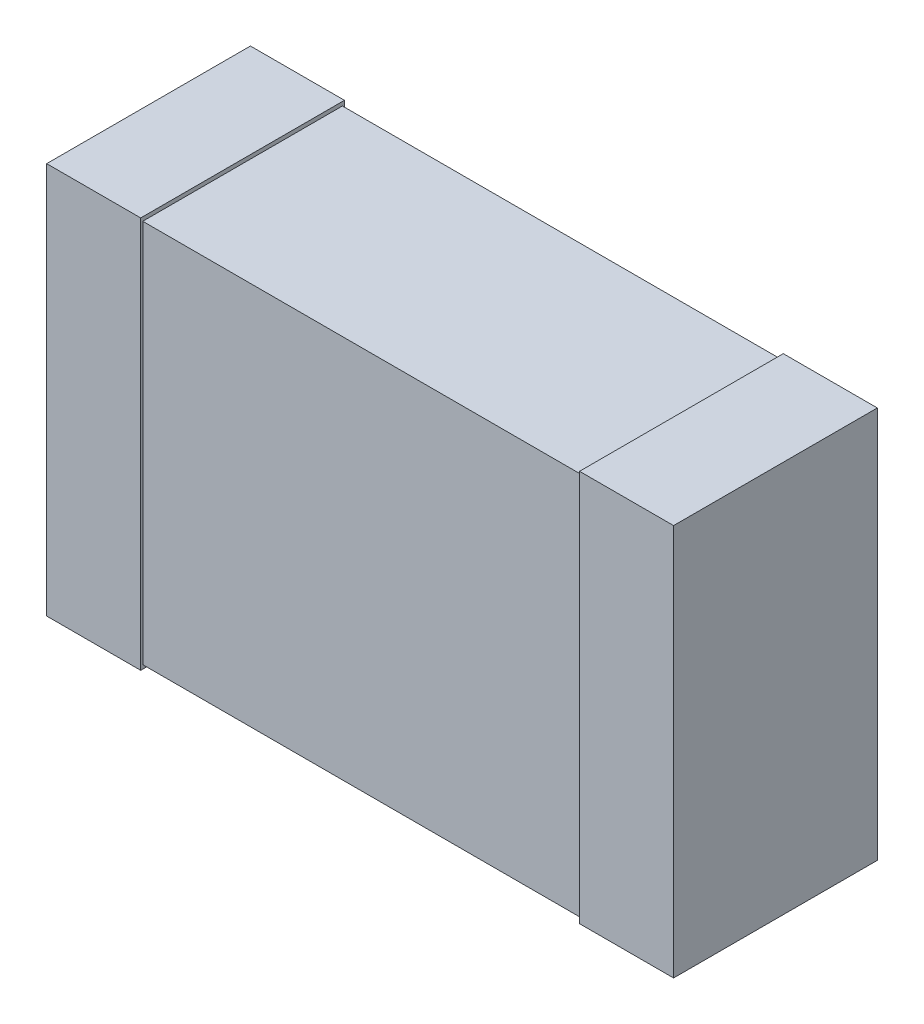
ISO-10303-21;
HEADER;
FILE_DESCRIPTION(('STEP AP214'),'2;1');
FILE_NAME('part.step','',(''),(''),'','','');
FILE_SCHEMA(('AUTOMOTIVE_DESIGN { 1 0 10303 214 1 1 1 1 }'));
ENDSEC;
DATA;
#1=APPLICATION_CONTEXT('core data for automotive mechanical design processes');
#2=APPLICATION_PROTOCOL_DEFINITION('international standard','automotive_design',2000,#1);
#3=PRODUCT_CONTEXT('',#1,'mechanical');
#4=PRODUCT('Part','Part','',(#3));
#5=PRODUCT_RELATED_PRODUCT_CATEGORY('part','',(#4));
#6=PRODUCT_DEFINITION_FORMATION('','',#4);
#7=PRODUCT_DEFINITION_CONTEXT('part definition',#1,'design');
#8=PRODUCT_DEFINITION('design','',#6,#7);
#9=PRODUCT_DEFINITION_SHAPE('','',#8);
#10=(LENGTH_UNIT() NAMED_UNIT(*) SI_UNIT(.MILLI.,.METRE.));
#11=(NAMED_UNIT(*) PLANE_ANGLE_UNIT() SI_UNIT($,.RADIAN.));
#12=(NAMED_UNIT(*) SI_UNIT($,.STERADIAN.) SOLID_ANGLE_UNIT());
#13=UNCERTAINTY_MEASURE_WITH_UNIT(LENGTH_MEASURE(1.E-05),#10,'distance_accuracy_value','');
#14=(GEOMETRIC_REPRESENTATION_CONTEXT(3) GLOBAL_UNCERTAINTY_ASSIGNED_CONTEXT((#13)) GLOBAL_UNIT_ASSIGNED_CONTEXT((#10,
#11,#12)) REPRESENTATION_CONTEXT('',''));
#15=CARTESIAN_POINT('',(0.,0.,0.));
#16=DIRECTION('',(0.,0.,1.));
#17=DIRECTION('',(1.,0.,0.));
#18=AXIS2_PLACEMENT_3D('',#15,#16,#17);
#19=CARTESIAN_POINT('',(-0.7,-0.6125,0.6435));
#20=DIRECTION('',(0.,0.,1.));
#21=DIRECTION('',(1.,0.,0.));
#22=AXIS2_PLACEMENT_3D('',#19,#20,#21);
#23=PLANE('',#22);
#24=DIRECTION('',(0.,1.,0.));
#25=VECTOR('',#24,1.);
#26=CARTESIAN_POINT('',(-0.7,-0.6125,0.6435));
#27=LINE('',#26,#25);
#28=CARTESIAN_POINT('',(-0.7,-0.6125,0.6435));
#29=VERTEX_POINT('',#28);
#30=CARTESIAN_POINT('',(-0.7,0.6125,0.6435));
#31=VERTEX_POINT('',#30);
#32=EDGE_CURVE('P0_E89',#29,#31,#27,.T.);
#33=ORIENTED_EDGE('',*,*,#32,.F.);
#34=DIRECTION('',(1.,0.,0.));
#35=VECTOR('',#34,1.);
#36=CARTESIAN_POINT('',(-0.7,-0.6125,0.6435));
#37=LINE('',#36,#35);
#38=CARTESIAN_POINT('',(0.7,-0.6125,0.6435));
#39=VERTEX_POINT('',#38);
#40=EDGE_CURVE('P0_E71',#29,#39,#37,.T.);
#41=ORIENTED_EDGE('',*,*,#40,.T.);
#42=DIRECTION('',(0.,1.,0.));
#43=VECTOR('',#42,1.);
#44=CARTESIAN_POINT('',(0.7,-0.6125,0.6435));
#45=LINE('',#44,#43);
#46=CARTESIAN_POINT('',(0.7,0.6125,0.6435));
#47=VERTEX_POINT('',#46);
#48=EDGE_CURVE('P0_E83',#39,#47,#45,.T.);
#49=ORIENTED_EDGE('',*,*,#48,.T.);
#50=DIRECTION('',(1.,0.,0.));
#51=VECTOR('',#50,1.);
#52=CARTESIAN_POINT('',(-0.7,0.6125,0.6435));
#53=LINE('',#52,#51);
#54=EDGE_CURVE('P0_E10',#31,#47,#53,.T.);
#55=ORIENTED_EDGE('',*,*,#54,.F.);
#56=EDGE_LOOP('',(#33,#41,#49,#55));
#57=FACE_BOUND('',#56,.T.);
#58=ADVANCED_FACE('P0_F17',(#57),#23,.T.);
#59=CARTESIAN_POINT('',(-0.7,-0.6125,0.0065));
#60=DIRECTION('',(0.,0.,1.));
#61=DIRECTION('',(1.,0.,0.));
#62=AXIS2_PLACEMENT_3D('',#59,#60,#61);
#63=PLANE('',#62);
#64=DIRECTION('',(1.,0.,0.));
#65=VECTOR('',#64,1.);
#66=CARTESIAN_POINT('',(-0.7,0.6125,0.0065));
#67=LINE('',#66,#65);
#68=CARTESIAN_POINT('',(-0.7,0.6125,0.0065));
#69=VERTEX_POINT('',#68);
#70=CARTESIAN_POINT('',(0.7,0.6125,0.0065));
#71=VERTEX_POINT('',#70);
#72=EDGE_CURVE('P0_E20',#69,#71,#67,.T.);
#73=ORIENTED_EDGE('',*,*,#72,.T.);
#74=DIRECTION('',(0.,1.,0.));
#75=VECTOR('',#74,1.);
#76=CARTESIAN_POINT('',(0.7,-0.6125,0.0065));
#77=LINE('',#76,#75);
#78=CARTESIAN_POINT('',(0.7,-0.6125,0.0065));
#79=VERTEX_POINT('',#78);
#80=EDGE_CURVE('P0_E103',#79,#71,#77,.T.);
#81=ORIENTED_EDGE('',*,*,#80,.F.);
#82=DIRECTION('',(1.,0.,0.));
#83=VECTOR('',#82,1.);
#84=CARTESIAN_POINT('',(-0.7,-0.6125,0.0065));
#85=LINE('',#84,#83);
#86=CARTESIAN_POINT('',(-0.7,-0.6125,0.0065));
#87=VERTEX_POINT('',#86);
#88=EDGE_CURVE('P0_E82',#87,#79,#85,.T.);
#89=ORIENTED_EDGE('',*,*,#88,.F.);
#90=DIRECTION('',(0.,1.,0.));
#91=VECTOR('',#90,1.);
#92=CARTESIAN_POINT('',(-0.7,-0.6125,0.0065));
#93=LINE('',#92,#91);
#94=EDGE_CURVE('P0_E90',#87,#69,#93,.T.);
#95=ORIENTED_EDGE('',*,*,#94,.T.);
#96=EDGE_LOOP('',(#73,#81,#89,#95));
#97=FACE_BOUND('',#96,.T.);
#98=ADVANCED_FACE('P0_F164',(#97),#63,.F.);
#99=CARTESIAN_POINT('',(-0.7,0.6125,0.0065));
#100=DIRECTION('',(0.,1.,0.));
#101=DIRECTION('',(1.,0.,0.));
#102=AXIS2_PLACEMENT_3D('',#99,#100,#101);
#103=PLANE('',#102);
#104=ORIENTED_EDGE('',*,*,#72,.F.);
#105=DIRECTION('',(0.,0.,1.));
#106=VECTOR('',#105,1.);
#107=CARTESIAN_POINT('',(-0.7,0.6125,0.0065));
#108=LINE('',#107,#106);
#109=EDGE_CURVE('P0_E94',#69,#31,#108,.T.);
#110=ORIENTED_EDGE('',*,*,#109,.T.);
#111=ORIENTED_EDGE('',*,*,#54,.T.);
#112=DIRECTION('',(0.,0.,1.));
#113=VECTOR('',#112,1.);
#114=CARTESIAN_POINT('',(0.7,0.6125,0.0065));
#115=LINE('',#114,#113);
#116=EDGE_CURVE('P0_E110',#71,#47,#115,.T.);
#117=ORIENTED_EDGE('',*,*,#116,.F.);
#118=EDGE_LOOP('',(#104,#110,#111,#117));
#119=FACE_BOUND('',#118,.T.);
#120=ADVANCED_FACE('P0_F154',(#119),#103,.T.);
#121=CARTESIAN_POINT('',(-0.7,-0.6125,0.0065));
#122=DIRECTION('',(0.,1.,0.));
#123=DIRECTION('',(1.,0.,0.));
#124=AXIS2_PLACEMENT_3D('',#121,#122,#123);
#125=PLANE('',#124);
#126=DIRECTION('',(0.,0.,1.));
#127=VECTOR('',#126,1.);
#128=CARTESIAN_POINT('',(0.7,-0.6125,0.0065));
#129=LINE('',#128,#127);
#130=EDGE_CURVE('P0_E77',#79,#39,#129,.T.);
#131=ORIENTED_EDGE('',*,*,#130,.T.);
#132=ORIENTED_EDGE('',*,*,#40,.F.);
#133=DIRECTION('',(0.,0.,1.));
#134=VECTOR('',#133,1.);
#135=CARTESIAN_POINT('',(-0.7,-0.6125,0.0065));
#136=LINE('',#135,#134);
#137=EDGE_CURVE('P0_E74',#87,#29,#136,.T.);
#138=ORIENTED_EDGE('',*,*,#137,.F.);
#139=ORIENTED_EDGE('',*,*,#88,.T.);
#140=EDGE_LOOP('',(#131,#132,#138,#139));
#141=FACE_BOUND('',#140,.T.);
#142=ADVANCED_FACE('P0_F73',(#141),#125,.F.);
#143=CARTESIAN_POINT('',(0.7,-0.6125,0.0065));
#144=DIRECTION('',(1.,0.,0.));
#145=DIRECTION('',(0.,1.,0.));
#146=AXIS2_PLACEMENT_3D('',#143,#144,#145);
#147=PLANE('',#146);
#148=ORIENTED_EDGE('',*,*,#130,.F.);
#149=ORIENTED_EDGE('',*,*,#80,.T.);
#150=ORIENTED_EDGE('',*,*,#116,.T.);
#151=ORIENTED_EDGE('',*,*,#48,.F.);
#152=EDGE_LOOP('',(#148,#149,#150,#151));
#153=FACE_BOUND('',#152,.T.);
#154=ADVANCED_FACE('P0_F133',(#153),#147,.T.);
#155=CARTESIAN_POINT('',(-0.7,-0.6125,0.0065));
#156=DIRECTION('',(1.,0.,0.));
#157=DIRECTION('',(0.,1.,0.));
#158=AXIS2_PLACEMENT_3D('',#155,#156,#157);
#159=PLANE('',#158);
#160=ORIENTED_EDGE('',*,*,#32,.T.);
#161=ORIENTED_EDGE('',*,*,#109,.F.);
#162=ORIENTED_EDGE('',*,*,#94,.F.);
#163=ORIENTED_EDGE('',*,*,#137,.T.);
#164=EDGE_LOOP('',(#160,#161,#162,#163));
#165=FACE_BOUND('',#164,.T.);
#166=ADVANCED_FACE('P0_F87',(#165),#159,.F.);
#167=CLOSED_SHELL('',(#58,#98,#120,#142,#154,#166));
#168=MANIFOLD_SOLID_BREP('P0_B1',#167);
#169=CARTESIAN_POINT('',(-1.,-0.625,0.65));
#170=DIRECTION('',(0.,0.,1.));
#171=DIRECTION('',(1.,0.,0.));
#172=AXIS2_PLACEMENT_3D('',#169,#170,#171);
#173=PLANE('',#172);
#174=DIRECTION('',(0.,1.,0.));
#175=VECTOR('',#174,1.);
#176=CARTESIAN_POINT('',(-1.,-0.625,0.65));
#177=LINE('',#176,#175);
#178=CARTESIAN_POINT('',(-1.,-0.625,0.65));
#179=VERTEX_POINT('',#178);
#180=CARTESIAN_POINT('',(-1.,0.625,0.65));
#181=VERTEX_POINT('',#180);
#182=EDGE_CURVE('P1_E91',#179,#181,#177,.T.);
#183=ORIENTED_EDGE('',*,*,#182,.F.);
#184=DIRECTION('',(1.,0.,0.));
#185=VECTOR('',#184,1.);
#186=CARTESIAN_POINT('',(-1.,-0.625,0.65));
#187=LINE('',#186,#185);
#188=CARTESIAN_POINT('',(-0.7,-0.625,0.65));
#189=VERTEX_POINT('',#188);
#190=EDGE_CURVE('P1_E73',#179,#189,#187,.T.);
#191=ORIENTED_EDGE('',*,*,#190,.T.);
#192=DIRECTION('',(0.,1.,0.));
#193=VECTOR('',#192,1.);
#194=CARTESIAN_POINT('',(-0.7,-0.625,0.65));
#195=LINE('',#194,#193);
#196=CARTESIAN_POINT('',(-0.7,0.625,0.65));
#197=VERTEX_POINT('',#196);
#198=EDGE_CURVE('P1_E85',#189,#197,#195,.T.);
#199=ORIENTED_EDGE('',*,*,#198,.T.);
#200=DIRECTION('',(1.,0.,0.));
#201=VECTOR('',#200,1.);
#202=CARTESIAN_POINT('',(-1.,0.625,0.65));
#203=LINE('',#202,#201);
#204=EDGE_CURVE('P1_E11',#181,#197,#203,.T.);
#205=ORIENTED_EDGE('',*,*,#204,.F.);
#206=EDGE_LOOP('',(#183,#191,#199,#205));
#207=FACE_BOUND('',#206,.T.);
#208=ADVANCED_FACE('P1_F18',(#207),#173,.T.);
#209=CARTESIAN_POINT('',(-1.,-0.625,0.));
#210=DIRECTION('',(0.,0.,1.));
#211=DIRECTION('',(1.,0.,0.));
#212=AXIS2_PLACEMENT_3D('',#209,#210,#211);
#213=PLANE('',#212);
#214=DIRECTION('',(1.,0.,0.));
#215=VECTOR('',#214,1.);
#216=CARTESIAN_POINT('',(-1.,0.625,0.));
#217=LINE('',#216,#215);
#218=CARTESIAN_POINT('',(-1.,0.625,0.));
#219=VERTEX_POINT('',#218);
#220=CARTESIAN_POINT('',(-0.7,0.625,0.));
#221=VERTEX_POINT('',#220);
#222=EDGE_CURVE('P1_E22',#219,#221,#217,.T.);
#223=ORIENTED_EDGE('',*,*,#222,.T.);
#224=DIRECTION('',(0.,1.,0.));
#225=VECTOR('',#224,1.);
#226=CARTESIAN_POINT('',(-0.7,-0.625,0.));
#227=LINE('',#226,#225);
#228=CARTESIAN_POINT('',(-0.7,-0.625,0.));
#229=VERTEX_POINT('',#228);
#230=EDGE_CURVE('P1_E108',#229,#221,#227,.T.);
#231=ORIENTED_EDGE('',*,*,#230,.F.);
#232=DIRECTION('',(1.,0.,0.));
#233=VECTOR('',#232,1.);
#234=CARTESIAN_POINT('',(-1.,-0.625,0.));
#235=LINE('',#234,#233);
#236=CARTESIAN_POINT('',(-1.,-0.625,0.));
#237=VERTEX_POINT('',#236);
#238=EDGE_CURVE('P1_E84',#237,#229,#235,.T.);
#239=ORIENTED_EDGE('',*,*,#238,.F.);
#240=DIRECTION('',(0.,1.,0.));
#241=VECTOR('',#240,1.);
#242=CARTESIAN_POINT('',(-1.,-0.625,0.));
#243=LINE('',#242,#241);
#244=EDGE_CURVE('P1_E92',#237,#219,#243,.T.);
#245=ORIENTED_EDGE('',*,*,#244,.T.);
#246=EDGE_LOOP('',(#223,#231,#239,#245));
#247=FACE_BOUND('',#246,.T.);
#248=ADVANCED_FACE('P1_F164',(#247),#213,.F.);
#249=CARTESIAN_POINT('',(-1.,0.625,0.));
#250=DIRECTION('',(0.,1.,0.));
#251=DIRECTION('',(1.,0.,0.));
#252=AXIS2_PLACEMENT_3D('',#249,#250,#251);
#253=PLANE('',#252);
#254=ORIENTED_EDGE('',*,*,#222,.F.);
#255=DIRECTION('',(0.,0.,1.));
#256=VECTOR('',#255,1.);
#257=CARTESIAN_POINT('',(-1.,0.625,0.));
#258=LINE('',#257,#256);
#259=EDGE_CURVE('P1_E96',#219,#181,#258,.T.);
#260=ORIENTED_EDGE('',*,*,#259,.T.);
#261=ORIENTED_EDGE('',*,*,#204,.T.);
#262=DIRECTION('',(0.,0.,1.));
#263=VECTOR('',#262,1.);
#264=CARTESIAN_POINT('',(-0.7,0.625,0.));
#265=LINE('',#264,#263);
#266=EDGE_CURVE('P1_E104',#221,#197,#265,.T.);
#267=ORIENTED_EDGE('',*,*,#266,.F.);
#268=EDGE_LOOP('',(#254,#260,#261,#267));
#269=FACE_BOUND('',#268,.T.);
#270=ADVANCED_FACE('P1_F20',(#269),#253,.T.);
#271=CARTESIAN_POINT('',(-1.,-0.625,0.));
#272=DIRECTION('',(0.,1.,0.));
#273=DIRECTION('',(1.,0.,0.));
#274=AXIS2_PLACEMENT_3D('',#271,#272,#273);
#275=PLANE('',#274);
#276=DIRECTION('',(0.,0.,1.));
#277=VECTOR('',#276,1.);
#278=CARTESIAN_POINT('',(-0.7,-0.625,0.));
#279=LINE('',#278,#277);
#280=EDGE_CURVE('P1_E79',#229,#189,#279,.T.);
#281=ORIENTED_EDGE('',*,*,#280,.T.);
#282=ORIENTED_EDGE('',*,*,#190,.F.);
#283=DIRECTION('',(0.,0.,1.));
#284=VECTOR('',#283,1.);
#285=CARTESIAN_POINT('',(-1.,-0.625,0.));
#286=LINE('',#285,#284);
#287=EDGE_CURVE('P1_E76',#237,#179,#286,.T.);
#288=ORIENTED_EDGE('',*,*,#287,.F.);
#289=ORIENTED_EDGE('',*,*,#238,.T.);
#290=EDGE_LOOP('',(#281,#282,#288,#289));
#291=FACE_BOUND('',#290,.T.);
#292=ADVANCED_FACE('P1_F75',(#291),#275,.F.);
#293=CARTESIAN_POINT('',(-0.7,-0.625,0.));
#294=DIRECTION('',(1.,0.,0.));
#295=DIRECTION('',(0.,1.,0.));
#296=AXIS2_PLACEMENT_3D('',#293,#294,#295);
#297=PLANE('',#296);
#298=ORIENTED_EDGE('',*,*,#280,.F.);
#299=ORIENTED_EDGE('',*,*,#230,.T.);
#300=ORIENTED_EDGE('',*,*,#266,.T.);
#301=ORIENTED_EDGE('',*,*,#198,.F.);
#302=EDGE_LOOP('',(#298,#299,#300,#301));
#303=FACE_BOUND('',#302,.T.);
#304=ADVANCED_FACE('P1_F134',(#303),#297,.T.);
#305=CARTESIAN_POINT('',(-1.,-0.625,0.));
#306=DIRECTION('',(1.,0.,0.));
#307=DIRECTION('',(0.,1.,0.));
#308=AXIS2_PLACEMENT_3D('',#305,#306,#307);
#309=PLANE('',#308);
#310=ORIENTED_EDGE('',*,*,#182,.T.);
#311=ORIENTED_EDGE('',*,*,#259,.F.);
#312=ORIENTED_EDGE('',*,*,#244,.F.);
#313=ORIENTED_EDGE('',*,*,#287,.T.);
#314=EDGE_LOOP('',(#310,#311,#312,#313));
#315=FACE_BOUND('',#314,.T.);
#316=ADVANCED_FACE('P1_F89',(#315),#309,.F.);
#317=CLOSED_SHELL('',(#208,#248,#270,#292,#304,#316));
#318=MANIFOLD_SOLID_BREP('P1_B1',#317);
#319=CARTESIAN_POINT('',(0.7,-0.625,0.65));
#320=DIRECTION('',(0.,0.,1.));
#321=DIRECTION('',(1.,0.,0.));
#322=AXIS2_PLACEMENT_3D('',#319,#320,#321);
#323=PLANE('',#322);
#324=DIRECTION('',(0.,1.,0.));
#325=VECTOR('',#324,1.);
#326=CARTESIAN_POINT('',(0.7,-0.625,0.65));
#327=LINE('',#326,#325);
#328=CARTESIAN_POINT('',(0.7,-0.625,0.65));
#329=VERTEX_POINT('',#328);
#330=CARTESIAN_POINT('',(0.7,0.625,0.65));
#331=VERTEX_POINT('',#330);
#332=EDGE_CURVE('P2_E89',#329,#331,#327,.T.);
#333=ORIENTED_EDGE('',*,*,#332,.F.);
#334=DIRECTION('',(1.,0.,0.));
#335=VECTOR('',#334,1.);
#336=CARTESIAN_POINT('',(0.7,-0.625,0.65));
#337=LINE('',#336,#335);
#338=CARTESIAN_POINT('',(1.,-0.625,0.65));
#339=VERTEX_POINT('',#338);
#340=EDGE_CURVE('P2_E73',#329,#339,#337,.T.);
#341=ORIENTED_EDGE('',*,*,#340,.T.);
#342=DIRECTION('',(0.,1.,0.));
#343=VECTOR('',#342,1.);
#344=CARTESIAN_POINT('',(1.,-0.625,0.65));
#345=LINE('',#344,#343);
#346=CARTESIAN_POINT('',(1.,0.625,0.65));
#347=VERTEX_POINT('',#346);
#348=EDGE_CURVE('P2_E84',#339,#347,#345,.T.);
#349=ORIENTED_EDGE('',*,*,#348,.T.);
#350=DIRECTION('',(1.,0.,0.));
#351=VECTOR('',#350,1.);
#352=CARTESIAN_POINT('',(0.7,0.625,0.65));
#353=LINE('',#352,#351);
#354=EDGE_CURVE('P2_E11',#331,#347,#353,.T.);
#355=ORIENTED_EDGE('',*,*,#354,.F.);
#356=EDGE_LOOP('',(#333,#341,#349,#355));
#357=FACE_BOUND('',#356,.T.);
#358=ADVANCED_FACE('P2_F18',(#357),#323,.T.);
#359=CARTESIAN_POINT('',(0.7,-0.625,0.));
#360=DIRECTION('',(0.,0.,1.));
#361=DIRECTION('',(1.,0.,0.));
#362=AXIS2_PLACEMENT_3D('',#359,#360,#361);
#363=PLANE('',#362);
#364=DIRECTION('',(1.,0.,0.));
#365=VECTOR('',#364,1.);
#366=CARTESIAN_POINT('',(0.7,0.625,0.));
#367=LINE('',#366,#365);
#368=CARTESIAN_POINT('',(0.7,0.625,0.));
#369=VERTEX_POINT('',#368);
#370=CARTESIAN_POINT('',(1.,0.625,0.));
#371=VERTEX_POINT('',#370);
#372=EDGE_CURVE('P2_E27',#369,#371,#367,.T.);
#373=ORIENTED_EDGE('',*,*,#372,.T.);
#374=DIRECTION('',(0.,1.,0.));
#375=VECTOR('',#374,1.);
#376=CARTESIAN_POINT('',(1.,-0.625,0.));
#377=LINE('',#376,#375);
#378=CARTESIAN_POINT('',(1.,-0.625,0.));
#379=VERTEX_POINT('',#378);
#380=EDGE_CURVE('P2_E105',#379,#371,#377,.T.);
#381=ORIENTED_EDGE('',*,*,#380,.F.);
#382=DIRECTION('',(1.,0.,0.));
#383=VECTOR('',#382,1.);
#384=CARTESIAN_POINT('',(0.7,-0.625,0.));
#385=LINE('',#384,#383);
#386=CARTESIAN_POINT('',(0.7,-0.625,0.));
#387=VERTEX_POINT('',#386);
#388=EDGE_CURVE('P2_E21',#387,#379,#385,.T.);
#389=ORIENTED_EDGE('',*,*,#388,.F.);
#390=DIRECTION('',(0.,1.,0.));
#391=VECTOR('',#390,1.);
#392=CARTESIAN_POINT('',(0.7,-0.625,0.));
#393=LINE('',#392,#391);
#394=EDGE_CURVE('P2_E90',#387,#369,#393,.T.);
#395=ORIENTED_EDGE('',*,*,#394,.T.);
#396=EDGE_LOOP('',(#373,#381,#389,#395));
#397=FACE_BOUND('',#396,.T.);
#398=ADVANCED_FACE('P2_F122',(#397),#363,.F.);
#399=CARTESIAN_POINT('',(0.7,0.625,0.));
#400=DIRECTION('',(0.,1.,0.));
#401=DIRECTION('',(1.,0.,0.));
#402=AXIS2_PLACEMENT_3D('',#399,#400,#401);
#403=PLANE('',#402);
#404=ORIENTED_EDGE('',*,*,#372,.F.);
#405=DIRECTION('',(0.,0.,1.));
#406=VECTOR('',#405,1.);
#407=CARTESIAN_POINT('',(0.7,0.625,0.));
#408=LINE('',#407,#406);
#409=EDGE_CURVE('P2_E94',#369,#331,#408,.T.);
#410=ORIENTED_EDGE('',*,*,#409,.T.);
#411=ORIENTED_EDGE('',*,*,#354,.T.);
#412=DIRECTION('',(0.,0.,1.));
#413=VECTOR('',#412,1.);
#414=CARTESIAN_POINT('',(1.,0.625,0.));
#415=LINE('',#414,#413);
#416=EDGE_CURVE('P2_E102',#371,#347,#415,.T.);
#417=ORIENTED_EDGE('',*,*,#416,.F.);
#418=EDGE_LOOP('',(#404,#410,#411,#417));
#419=FACE_BOUND('',#418,.T.);
#420=ADVANCED_FACE('P2_F121',(#419),#403,.T.);
#421=CARTESIAN_POINT('',(0.7,-0.625,0.));
#422=DIRECTION('',(0.,1.,0.));
#423=DIRECTION('',(1.,0.,0.));
#424=AXIS2_PLACEMENT_3D('',#421,#422,#423);
#425=PLANE('',#424);
#426=DIRECTION('',(0.,0.,1.));
#427=VECTOR('',#426,1.);
#428=CARTESIAN_POINT('',(1.,-0.625,0.));
#429=LINE('',#428,#427);
#430=EDGE_CURVE('P2_E79',#379,#339,#429,.T.);
#431=ORIENTED_EDGE('',*,*,#430,.T.);
#432=ORIENTED_EDGE('',*,*,#340,.F.);
#433=DIRECTION('',(0.,0.,1.));
#434=VECTOR('',#433,1.);
#435=CARTESIAN_POINT('',(0.7,-0.625,0.));
#436=LINE('',#435,#434);
#437=EDGE_CURVE('P2_E76',#387,#329,#436,.T.);
#438=ORIENTED_EDGE('',*,*,#437,.F.);
#439=ORIENTED_EDGE('',*,*,#388,.T.);
#440=EDGE_LOOP('',(#431,#432,#438,#439));
#441=FACE_BOUND('',#440,.T.);
#442=ADVANCED_FACE('P2_F75',(#441),#425,.F.);
#443=CARTESIAN_POINT('',(1.,-0.625,0.));
#444=DIRECTION('',(1.,0.,0.));
#445=DIRECTION('',(0.,1.,0.));
#446=AXIS2_PLACEMENT_3D('',#443,#444,#445);
#447=PLANE('',#446);
#448=ORIENTED_EDGE('',*,*,#430,.F.);
#449=ORIENTED_EDGE('',*,*,#380,.T.);
#450=ORIENTED_EDGE('',*,*,#416,.T.);
#451=ORIENTED_EDGE('',*,*,#348,.F.);
#452=EDGE_LOOP('',(#448,#449,#450,#451));
#453=FACE_BOUND('',#452,.T.);
#454=ADVANCED_FACE('P2_F120',(#453),#447,.T.);
#455=CARTESIAN_POINT('',(0.7,-0.625,0.));
#456=DIRECTION('',(1.,0.,0.));
#457=DIRECTION('',(0.,1.,0.));
#458=AXIS2_PLACEMENT_3D('',#455,#456,#457);
#459=PLANE('',#458);
#460=ORIENTED_EDGE('',*,*,#332,.T.);
#461=ORIENTED_EDGE('',*,*,#409,.F.);
#462=ORIENTED_EDGE('',*,*,#394,.F.);
#463=ORIENTED_EDGE('',*,*,#437,.T.);
#464=EDGE_LOOP('',(#460,#461,#462,#463));
#465=FACE_BOUND('',#464,.T.);
#466=ADVANCED_FACE('P2_F87',(#465),#459,.F.);
#467=CLOSED_SHELL('',(#358,#398,#420,#442,#454,#466));
#468=MANIFOLD_SOLID_BREP('P2_B1',#467);
#469=ADVANCED_BREP_SHAPE_REPRESENTATION('',(#18,#168,#318,#468),#14);
#470=SHAPE_DEFINITION_REPRESENTATION(#9,#469);
ENDSEC;
END-ISO-10303-21;
